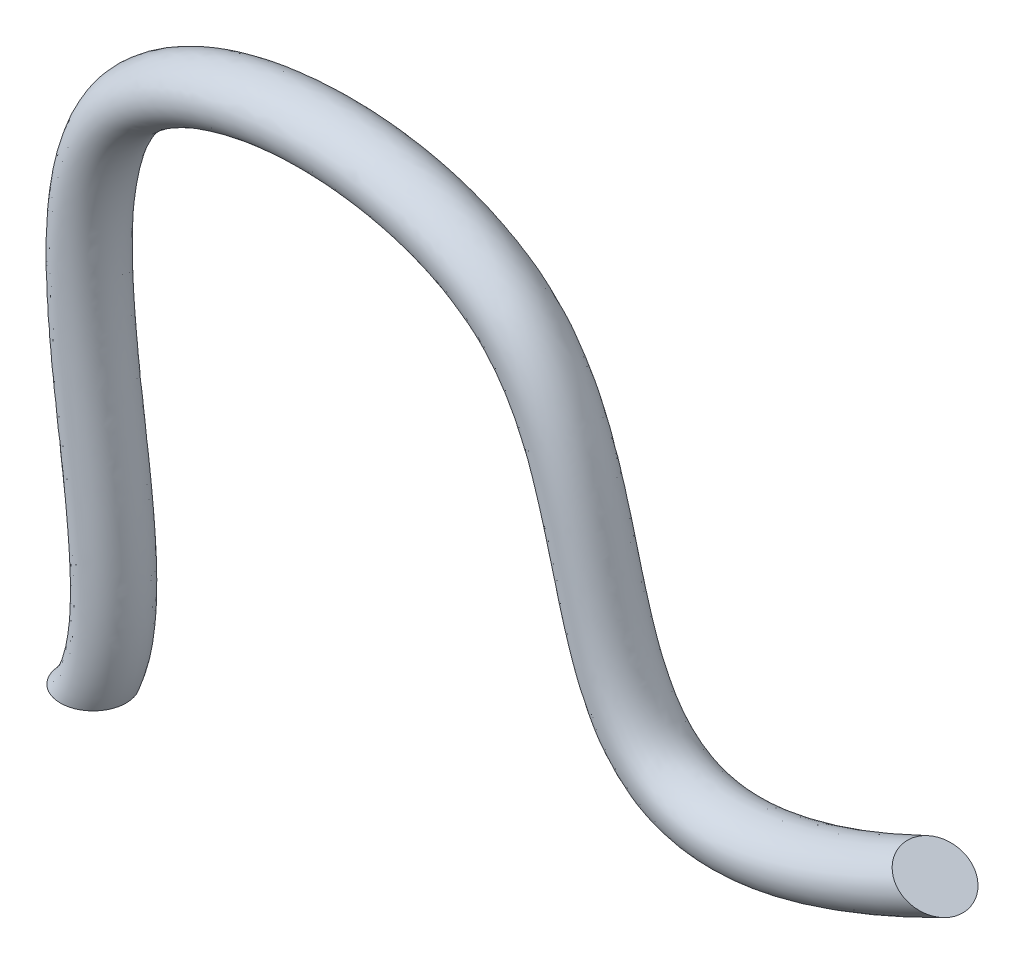
ISO-10303-21;
HEADER;
FILE_DESCRIPTION(('STEP AP214'),'2;1');
FILE_NAME('part.step','',(''),(''),'','','');
FILE_SCHEMA(('AUTOMOTIVE_DESIGN { 1 0 10303 214 1 1 1 1 }'));
ENDSEC;
DATA;
#1=APPLICATION_CONTEXT('core data for automotive mechanical design processes');
#2=APPLICATION_PROTOCOL_DEFINITION('international standard','automotive_design',2000,#1);
#3=PRODUCT_CONTEXT('',#1,'mechanical');
#4=PRODUCT('Part','Part','',(#3));
#5=PRODUCT_RELATED_PRODUCT_CATEGORY('part','',(#4));
#6=PRODUCT_DEFINITION_FORMATION('','',#4);
#7=PRODUCT_DEFINITION_CONTEXT('part definition',#1,'design');
#8=PRODUCT_DEFINITION('design','',#6,#7);
#9=PRODUCT_DEFINITION_SHAPE('','',#8);
#10=(LENGTH_UNIT() NAMED_UNIT(*) SI_UNIT(.MILLI.,.METRE.));
#11=(NAMED_UNIT(*) PLANE_ANGLE_UNIT() SI_UNIT($,.RADIAN.));
#12=(NAMED_UNIT(*) SI_UNIT($,.STERADIAN.) SOLID_ANGLE_UNIT());
#13=UNCERTAINTY_MEASURE_WITH_UNIT(LENGTH_MEASURE(1.E-05),#10,'distance_accuracy_value','');
#14=(GEOMETRIC_REPRESENTATION_CONTEXT(3) GLOBAL_UNCERTAINTY_ASSIGNED_CONTEXT((#13)) GLOBAL_UNIT_ASSIGNED_CONTEXT((#10,
#11,#12)) REPRESENTATION_CONTEXT('',''));
#15=CARTESIAN_POINT('',(0.,0.,0.));
#16=DIRECTION('',(0.,0.,1.));
#17=DIRECTION('',(1.,0.,0.));
#18=AXIS2_PLACEMENT_3D('',#15,#16,#17);
#19=CARTESIAN_POINT('',(0.,0.,0.));
#20=DIRECTION('',(0.,1.,0.));
#21=DIRECTION('',(0.,0.,1.));
#22=AXIS2_PLACEMENT_3D('',#19,#20,#21);
#23=PLANE('',#22);
#24=CARTESIAN_POINT('',(0.,0.,0.));
#25=DIRECTION('',(0.,1.,0.));
#26=DIRECTION('',(0.,0.,1.));
#27=AXIS2_PLACEMENT_3D('',#24,#25,#26);
#28=CIRCLE('',#27,3.81);
#29=CARTESIAN_POINT('',(0.,0.,3.81));
#30=VERTEX_POINT('',#29);
#31=EDGE_CURVE('E43',#30,#30,#28,.T.);
#32=ORIENTED_EDGE('',*,*,#31,.F.);
#33=EDGE_LOOP('',(#32));
#34=FACE_BOUND('',#33,.T.);
#35=ADVANCED_FACE('F37',(#34),#23,.F.);
#36=CARTESIAN_POINT('',(97.689172301197,29.5061660798113,0.));
#37=DIRECTION('',(0.5383872814832,0.842697534787618,0.));
#38=DIRECTION('',(0.,0.,1.));
#39=AXIS2_PLACEMENT_3D('',#36,#37,#38);
#40=PLANE('',#39);
#41=CARTESIAN_POINT('',(97.689172301197,29.5061660798113,0.));
#42=DIRECTION('',(0.5383872814832,0.842697534787618,0.));
#43=DIRECTION('',(0.,0.,1.));
#44=AXIS2_PLACEMENT_3D('',#41,#42,#43);
#45=CIRCLE('',#44,3.81);
#46=CARTESIAN_POINT('',(97.689172301197,29.5061660798113,3.81));
#47=VERTEX_POINT('',#46);
#48=EDGE_CURVE('E10',#47,#47,#45,.T.);
#49=ORIENTED_EDGE('',*,*,#48,.T.);
#50=EDGE_LOOP('',(#49));
#51=FACE_BOUND('',#50,.T.);
#52=ADVANCED_FACE('F52',(#51),#40,.T.);
#53=CARTESIAN_POINT('',(0.,0.,3.81));
#54=CARTESIAN_POINT('',(0.499544112924463,0.822005325097772,3.81));
#55=CARTESIAN_POINT('',(0.905078244488626,1.72269345057556,3.81));
#56=CARTESIAN_POINT('',(1.55395086488842,3.66234698235743,3.81));
#57=CARTESIAN_POINT('',(1.79728935254207,4.70131238953548,3.81));
#58=CARTESIAN_POINT('',(2.32274784063492,7.99699204557944,3.81));
#59=CARTESIAN_POINT('',(2.40031085917219,10.432489734156,3.81));
#60=CARTESIAN_POINT('',(2.21654621150553,15.6275343612159,3.81));
#61=CARTESIAN_POINT('',(1.95521854179704,18.387081302277,3.81));
#62=CARTESIAN_POINT('',(1.30026710443377,24.0775178550066,3.81));
#63=CARTESIAN_POINT('',(0.906643333910792,27.0084074687676,3.81));
#64=CARTESIAN_POINT('',(0.193694282196926,32.8888227872027,3.81));
#65=CARTESIAN_POINT('',(-0.125631001657487,35.8383484938451,3.81));
#66=CARTESIAN_POINT('',(-0.483388492398308,41.6033294180553,3.81));
#67=CARTESIAN_POINT('',(-0.521820702085268,44.4187846377239,3.81));
#68=CARTESIAN_POINT('',(-0.111197456538713,49.7629180078189,3.81));
#69=CARTESIAN_POINT('',(0.337857995462337,52.2915961606373,3.81));
#70=CARTESIAN_POINT('',(1.93005115257658,56.9094688167282,3.81));
#71=CARTESIAN_POINT('',(3.07318885473179,58.9986633225116,3.81));
#72=CARTESIAN_POINT('',(5.82868402124777,62.0993540958641,3.81));
#73=CARTESIAN_POINT('',(7.23018589179445,63.2494867957873,3.81));
#74=CARTESIAN_POINT('',(10.3979558979706,65.2319716083923,3.81));
#75=CARTESIAN_POINT('',(12.1642240366591,66.0643237212365,3.81));
#76=CARTESIAN_POINT('',(17.8388787781101,68.0804143462445,3.81));
#77=CARTESIAN_POINT('',(22.1231157158546,68.7831871448887,3.81));
#78=CARTESIAN_POINT('',(30.7802620869203,68.8832517289654,3.81));
#79=CARTESIAN_POINT('',(35.1531715257224,68.2805435144935,3.81));
#80=CARTESIAN_POINT('',(41.093843770632,66.38019110009,3.81));
#81=CARTESIAN_POINT('',(42.9709525356306,65.5806919465548,3.81));
#82=CARTESIAN_POINT('',(46.4047400452893,63.6467337197167,3.81));
#83=CARTESIAN_POINT('',(47.9614187926497,62.5122746462521,3.81));
#84=CARTESIAN_POINT('',(51.292070842978,59.2711288841867,3.81));
#85=CARTESIAN_POINT('',(52.8030064250359,56.9599916211141,3.81));
#86=CARTESIAN_POINT('',(55.2267709640214,51.9288420171132,3.81));
#87=CARTESIAN_POINT('',(56.139599916733,49.2088296718489,3.81));
#88=CARTESIAN_POINT('',(57.7297494095193,43.6977791089932,3.81));
#89=CARTESIAN_POINT('',(58.4070699445642,40.906740886752,3.81));
#90=CARTESIAN_POINT('',(59.8888008129707,35.5914877749684,3.81));
#91=CARTESIAN_POINT('',(60.6932111409211,33.0672728803798,3.81));
#92=CARTESIAN_POINT('',(62.2670926405137,29.7344549423049,3.81));
#93=CARTESIAN_POINT('',(62.8529308058004,28.6990996946164,3.81));
#94=CARTESIAN_POINT('',(64.1923539173928,26.8217884863889,3.81));
#95=CARTESIAN_POINT('',(64.9459388599319,25.9798325223859,3.81));
#96=CARTESIAN_POINT('',(66.6661803026741,24.5315510324037,3.81));
#97=CARTESIAN_POINT('',(67.6328367989934,23.9252255028321,3.81));
#98=CARTESIAN_POINT('',(69.8245461253426,22.9904360321554,3.81));
#99=CARTESIAN_POINT('',(71.0495989519789,22.6619720877986,3.81));
#100=CARTESIAN_POINT('',(73.8034257145377,22.3251369374415,3.81));
#101=CARTESIAN_POINT('',(75.3321996478941,22.3167657289968,3.81));
#102=CARTESIAN_POINT('',(78.7387933993859,22.6623472001919,3.81));
#103=CARTESIAN_POINT('',(80.6166132157202,23.0162998782031,3.81));
#104=CARTESIAN_POINT('',(86.8416286556984,24.6849904693055,3.81));
#105=CARTESIAN_POINT('',(91.7803802668383,26.606560936718,3.81));
#106=CARTESIAN_POINT('',(97.689172301197,29.5061660798113,3.81));
#107=CARTESIAN_POINT('',(7.62,0.,3.81));
#108=CARTESIAN_POINT('',(8.11954410888391,1.46209831678373,3.81));
#109=CARTESIAN_POINT('',(8.44468608640024,2.93091192344135,3.81));
#110=CARTESIAN_POINT('',(8.87614986005999,5.82819097738221,3.81));
#111=CARTESIAN_POINT('',(8.98351374140144,7.25969394565483,3.81));
#112=CARTESIAN_POINT('',(9.11136774605483,11.5282791290489,3.81));
#113=CARTESIAN_POINT('',(8.94380374632661,14.3503154299714,3.81));
#114=CARTESIAN_POINT('',(8.408783224927,20.0798212034479,3.81));
#115=CARTESIAN_POINT('',(8.03271573080499,22.9847182535783,3.81));
#116=CARTESIAN_POINT('',(7.25603641816095,28.8317843075131,3.81));
#117=CARTESIAN_POINT('',(6.85452332777499,31.7719536161747,3.81));
#118=CARTESIAN_POINT('',(6.22218983111786,37.5499267053511,3.81));
#119=CARTESIAN_POINT('',(5.99190375726283,40.3877898108017,3.81));
#120=CARTESIAN_POINT('',(5.9075152723849,45.7600104123651,3.81));
#121=CARTESIAN_POINT('',(6.05624512329866,48.2950314224914,3.81));
#122=CARTESIAN_POINT('',(6.9024682367422,52.780322963931,3.81));
#123=CARTESIAN_POINT('',(7.60736152843821,54.7226333787368,3.81));
#124=CARTESIAN_POINT('',(9.5527597994372,57.7156551606846,3.81));
#125=CARTESIAN_POINT('',(10.7721554150462,58.7421349221768,3.81));
#126=CARTESIAN_POINT('',(13.1771512790867,59.9215763609999,3.81));
#127=CARTESIAN_POINT('',(14.3217638931273,60.3911887557841,3.81));
#128=CARTESIAN_POINT('',(16.9246062569289,61.2491106583587,3.81));
#129=CARTESIAN_POINT('',(18.3816332389282,61.6318519550647,3.81));
#130=CARTESIAN_POINT('',(23.131070922182,62.5116231917697,3.81));
#131=CARTESIAN_POINT('',(26.8058736224671,62.7231721072226,3.81));
#132=CARTESIAN_POINT('',(34.1621615663983,62.0119520134837,3.81));
#133=CARTESIAN_POINT('',(37.8389420531112,61.0896298272271,3.81));
#134=CARTESIAN_POINT('',(42.4286966234305,58.8637345810533,3.81));
#135=CARTESIAN_POINT('',(43.8020202455058,57.9840575215896,3.81));
#136=CARTESIAN_POINT('',(46.0786384715308,56.0117362819636,3.81));
#137=CARTESIAN_POINT('',(46.9783074839113,54.9197137605528,3.81));
#138=CARTESIAN_POINT('',(48.5130090274343,52.0909533297121,3.81));
#139=CARTESIAN_POINT('',(49.2005139993151,50.2138070730781,3.81));
#140=CARTESIAN_POINT('',(50.5312293740737,45.892216565982,3.81));
#141=CARTESIAN_POINT('',(51.1404015970668,43.4538430110515,3.81));
#142=CARTESIAN_POINT('',(52.4099348017005,38.2377948736002,3.81));
#143=CARTESIAN_POINT('',(53.0666938483004,35.4682938551115,3.81));
#144=CARTESIAN_POINT('',(54.8091894924707,29.9087180460883,3.81));
#145=CARTESIAN_POINT('',(55.8900589179423,27.1074723196976,3.81));
#146=CARTESIAN_POINT('',(58.3710242545431,23.1757717961821,3.81));
#147=CARTESIAN_POINT('',(59.3465665244375,21.9115839861802,3.81));
#148=CARTESIAN_POINT('',(61.6937513016498,19.6022355305877,3.81));
#149=CARTESIAN_POINT('',(63.0705646072762,18.5594711055035,3.81));
#150=CARTESIAN_POINT('',(66.2083180223362,16.8915802059023,3.81));
#151=CARTESIAN_POINT('',(67.9649196376562,16.2745196687116,3.81));
#152=CARTESIAN_POINT('',(71.6631858531954,15.5565283962787,3.81));
#153=CARTESIAN_POINT('',(73.5953481307595,15.4505129646695,3.81));
#154=CARTESIAN_POINT('',(77.5325789282418,15.6483564325692,3.81));
#155=CARTESIAN_POINT('',(79.5415766368954,15.9466488985735,3.81));
#156=CARTESIAN_POINT('',(83.7181010736276,16.8741058289712,3.81));
#157=CARTESIAN_POINT('',(85.8892271515796,17.5044565711906,3.81));
#158=CARTESIAN_POINT('',(92.821684478563,19.9132790568948,3.81));
#159=CARTESIAN_POINT('',(98.0144667534702,22.2109320511066,3.81));
#160=CARTESIAN_POINT('',(104.110527516279,25.4036549949093,3.81));
#161=CARTESIAN_POINT('',(7.62,0.,-3.81));
#162=CARTESIAN_POINT('',(8.11954410888391,1.46209831678373,-3.81));
#163=CARTESIAN_POINT('',(8.44468608640024,2.93091192344135,-3.81));
#164=CARTESIAN_POINT('',(8.87614986005999,5.82819097738221,-3.81));
#165=CARTESIAN_POINT('',(8.9835137414012,7.25969394565483,-3.81));
#166=CARTESIAN_POINT('',(9.11136774605531,11.5282791290489,-3.81));
#167=CARTESIAN_POINT('',(8.94380374632661,14.3503154299725,-3.81));
#168=CARTESIAN_POINT('',(8.408783224927,20.0798212034468,-3.81));
#169=CARTESIAN_POINT('',(8.03271573080499,22.9847182535758,-3.81));
#170=CARTESIAN_POINT('',(7.25603641816095,28.8317843075156,-3.81));
#171=CARTESIAN_POINT('',(6.85452332777564,31.7719536161747,-3.81));
#172=CARTESIAN_POINT('',(6.22218983111722,37.5499267053511,-3.81));
#173=CARTESIAN_POINT('',(5.99190375726346,40.3877898108067,-3.81));
#174=CARTESIAN_POINT('',(5.90751527238427,45.7600104123601,-3.81));
#175=CARTESIAN_POINT('',(6.05624512329866,48.2950314224914,-3.81));
#176=CARTESIAN_POINT('',(6.9024682367422,52.780322963931,-3.81));
#177=CARTESIAN_POINT('',(7.60736152843821,54.7226333787368,-3.81));
#178=CARTESIAN_POINT('',(9.5527597994372,57.7156551606846,-3.81));
#179=CARTESIAN_POINT('',(10.7721554150462,58.7421349221768,-3.81));
#180=CARTESIAN_POINT('',(13.1771512790867,59.9215763609999,-3.81));
#181=CARTESIAN_POINT('',(14.3217638931273,60.3911887557841,-3.81));
#182=CARTESIAN_POINT('',(16.9246062569289,61.2491106583587,-3.81));
#183=CARTESIAN_POINT('',(18.381633238929,61.6318519550647,-3.81));
#184=CARTESIAN_POINT('',(23.1310709221803,62.5116231917697,-3.81));
#185=CARTESIAN_POINT('',(26.8058736224671,62.7231721072226,-3.81));
#186=CARTESIAN_POINT('',(34.1621615663983,62.0119520134837,-3.81));
#187=CARTESIAN_POINT('',(37.8389420531112,61.0896298272271,-3.81));
#188=CARTESIAN_POINT('',(42.4286966234305,58.8637345810533,-3.81));
#189=CARTESIAN_POINT('',(43.8020202455058,57.9840575215828,-3.81));
#190=CARTESIAN_POINT('',(46.0786384715308,56.0117362819704,-3.81));
#191=CARTESIAN_POINT('',(46.9783074839113,54.9197137605528,-3.81));
#192=CARTESIAN_POINT('',(48.5130090274343,52.0909533297121,-3.81));
#193=CARTESIAN_POINT('',(49.20051399932,50.2138070730781,-3.81));
#194=CARTESIAN_POINT('',(50.5312293740689,45.892216565982,-3.81));
#195=CARTESIAN_POINT('',(51.1404015970668,43.4538430110515,-3.81));
#196=CARTESIAN_POINT('',(52.4099348017005,38.2377948736002,-3.81));
#197=CARTESIAN_POINT('',(53.0666938483004,35.4682938551115,-3.81));
#198=CARTESIAN_POINT('',(54.8091894924707,29.9087180460883,-3.81));
#199=CARTESIAN_POINT('',(55.8900589179423,27.1074723197018,-3.81));
#200=CARTESIAN_POINT('',(58.3710242545431,23.1757717961799,-3.81));
#201=CARTESIAN_POINT('',(59.3465665244375,21.9115839861822,-3.81));
#202=CARTESIAN_POINT('',(61.6937513016498,19.6022355305857,-3.81));
#203=CARTESIAN_POINT('',(63.0705646072762,18.5594711055016,-3.81));
#204=CARTESIAN_POINT('',(66.2083180223362,16.8915802059042,-3.81));
#205=CARTESIAN_POINT('',(67.9649196376562,16.2745196687116,-3.81));
#206=CARTESIAN_POINT('',(71.6631858531954,15.5565283962787,-3.81));
#207=CARTESIAN_POINT('',(73.5953481307595,15.4505129646695,-3.81));
#208=CARTESIAN_POINT('',(77.5325789282418,15.6483564325692,-3.81));
#209=CARTESIAN_POINT('',(79.5415766368895,15.9466488985735,-3.81));
#210=CARTESIAN_POINT('',(83.7181010736335,16.8741058289712,-3.81));
#211=CARTESIAN_POINT('',(85.8892271515796,17.5044565711924,-3.81));
#212=CARTESIAN_POINT('',(92.821684478563,19.9132790568911,-3.81));
#213=CARTESIAN_POINT('',(98.0144667534702,22.2109320510609,-3.81));
#214=CARTESIAN_POINT('',(104.110527516279,25.4036549949093,-3.81));
#215=CARTESIAN_POINT('',(0.,0.,-3.81));
#216=CARTESIAN_POINT('',(0.499544112924464,0.822005325097772,-3.81));
#217=CARTESIAN_POINT('',(0.905078244488627,1.72269345057556,-3.81));
#218=CARTESIAN_POINT('',(1.55395086488842,3.66234698235743,-3.81));
#219=CARTESIAN_POINT('',(1.79728935254207,4.70131238953548,-3.81));
#220=CARTESIAN_POINT('',(2.32274784063492,7.99699204557944,-3.81));
#221=CARTESIAN_POINT('',(2.40031085917219,10.432489734156,-3.81));
#222=CARTESIAN_POINT('',(2.21654621150553,15.6275343612159,-3.81));
#223=CARTESIAN_POINT('',(1.95521854179704,18.387081302277,-3.81));
#224=CARTESIAN_POINT('',(1.30026710443377,24.0775178550066,-3.81));
#225=CARTESIAN_POINT('',(0.906643333910792,27.0084074687676,-3.81));
#226=CARTESIAN_POINT('',(0.193694282196926,32.8888227872027,-3.81));
#227=CARTESIAN_POINT('',(-0.125631001657487,35.8383484938451,-3.81));
#228=CARTESIAN_POINT('',(-0.483388492398308,41.6033294180553,-3.81));
#229=CARTESIAN_POINT('',(-0.521820702085268,44.4187846377239,-3.81));
#230=CARTESIAN_POINT('',(-0.111197456538713,49.7629180078189,-3.81));
#231=CARTESIAN_POINT('',(0.337857995462337,52.2915961606373,-3.81));
#232=CARTESIAN_POINT('',(1.93005115257658,56.9094688167282,-3.81));
#233=CARTESIAN_POINT('',(3.07318885473179,58.9986633225116,-3.81));
#234=CARTESIAN_POINT('',(5.82868402124777,62.0993540958641,-3.81));
#235=CARTESIAN_POINT('',(7.23018589179445,63.2494867957873,-3.81));
#236=CARTESIAN_POINT('',(10.3979558979706,65.2319716083923,-3.81));
#237=CARTESIAN_POINT('',(12.1642240366591,66.0643237212365,-3.81));
#238=CARTESIAN_POINT('',(17.8388787781101,68.0804143462445,-3.81));
#239=CARTESIAN_POINT('',(22.1231157158546,68.7831871448887,-3.81));
#240=CARTESIAN_POINT('',(30.7802620869203,68.8832517289654,-3.81));
#241=CARTESIAN_POINT('',(35.1531715257224,68.2805435144935,-3.81));
#242=CARTESIAN_POINT('',(41.093843770632,66.38019110009,-3.81));
#243=CARTESIAN_POINT('',(42.9709525356306,65.5806919465548,-3.81));
#244=CARTESIAN_POINT('',(46.4047400452893,63.6467337197167,-3.81));
#245=CARTESIAN_POINT('',(47.9614187926497,62.5122746462521,-3.81));
#246=CARTESIAN_POINT('',(51.292070842978,59.2711288841867,-3.81));
#247=CARTESIAN_POINT('',(52.8030064250359,56.9599916211141,-3.81));
#248=CARTESIAN_POINT('',(55.2267709640214,51.9288420171132,-3.81));
#249=CARTESIAN_POINT('',(56.139599916733,49.2088296718489,-3.81));
#250=CARTESIAN_POINT('',(57.7297494095193,43.6977791089932,-3.81));
#251=CARTESIAN_POINT('',(58.4070699445642,40.906740886752,-3.81));
#252=CARTESIAN_POINT('',(59.8888008129707,35.5914877749684,-3.81));
#253=CARTESIAN_POINT('',(60.6932111409211,33.0672728803798,-3.81));
#254=CARTESIAN_POINT('',(62.2670926405137,29.7344549423049,-3.81));
#255=CARTESIAN_POINT('',(62.8529308058004,28.6990996946164,-3.81));
#256=CARTESIAN_POINT('',(64.1923539173928,26.8217884863889,-3.81));
#257=CARTESIAN_POINT('',(64.9459388599319,25.9798325223859,-3.81));
#258=CARTESIAN_POINT('',(66.6661803026741,24.5315510324037,-3.81));
#259=CARTESIAN_POINT('',(67.6328367989934,23.9252255028321,-3.81));
#260=CARTESIAN_POINT('',(69.8245461253426,22.9904360321554,-3.81));
#261=CARTESIAN_POINT('',(71.0495989519789,22.6619720877986,-3.81));
#262=CARTESIAN_POINT('',(73.8034257145377,22.3251369374415,-3.81));
#263=CARTESIAN_POINT('',(75.3321996478941,22.3167657289968,-3.81));
#264=CARTESIAN_POINT('',(78.7387933993859,22.6623472001919,-3.81));
#265=CARTESIAN_POINT('',(80.6166132157202,23.0162998782031,-3.81));
#266=CARTESIAN_POINT('',(86.8416286556984,24.6849904693055,-3.81));
#267=CARTESIAN_POINT('',(91.7803802668383,26.606560936718,-3.81));
#268=CARTESIAN_POINT('',(97.689172301197,29.5061660798113,-3.81));
#269=CARTESIAN_POINT('',(-7.62,0.,-3.81));
#270=CARTESIAN_POINT('',(-7.12045588303498,0.181912333411809,-3.81));
#271=CARTESIAN_POINT('',(-6.63452959742298,0.514474977709772,-3.81));
#272=CARTESIAN_POINT('',(-5.76824813028314,1.49650298733264,-3.81));
#273=CARTESIAN_POINT('',(-5.38893503631706,2.14293083341613,-3.81));
#274=CARTESIAN_POINT('',(-4.46587206478548,4.46570496210998,-3.81));
#275=CARTESIAN_POINT('',(-4.14318202798223,6.51466403833952,-3.81));
#276=CARTESIAN_POINT('',(-3.97569080191594,11.1752475189851,-3.81));
#277=CARTESIAN_POINT('',(-4.12227864721092,13.7894443509781,-3.81));
#278=CARTESIAN_POINT('',(-4.65550220929341,19.3232514024976,-3.81));
#279=CARTESIAN_POINT('',(-5.04123665995405,22.2448613213604,-3.81));
#280=CARTESIAN_POINT('',(-5.83480126672337,28.2277188690542,-3.81));
#281=CARTESIAN_POINT('',(-6.24316576057843,31.2889071768836,-3.81));
#282=CARTESIAN_POINT('',(-6.87429225718089,37.4466484237505,-3.81));
#283=CARTESIAN_POINT('',(-7.09988652746919,40.5425378529564,-3.81));
#284=CARTESIAN_POINT('',(-7.12486314981962,46.7455130517067,-3.81));
#285=CARTESIAN_POINT('',(-6.93164553751353,49.8605589425379,-3.81));
#286=CARTESIAN_POINT('',(-5.69265749428405,56.1032824727718,-3.81));
#287=CARTESIAN_POINT('',(-4.62577770558258,59.2551917228463,-3.81));
#288=CARTESIAN_POINT('',(-1.5197832365912,64.2771318307284,-3.81));
#289=CARTESIAN_POINT('',(0.138607890461597,66.1077848357905,-3.81));
#290=CARTESIAN_POINT('',(3.87130553901234,69.214832558426,-3.81));
#291=CARTESIAN_POINT('',(5.94681483438912,70.4967954874084,-3.81));
#292=CARTESIAN_POINT('',(12.54668663404,73.6492055007193,-3.81));
#293=CARTESIAN_POINT('',(17.4403578092421,74.8432021825549,-3.81));
#294=CARTESIAN_POINT('',(27.3983626074424,75.754551444447,-3.81));
#295=CARTESIAN_POINT('',(32.4674009983337,75.4714572017599,-3.81));
#296=CARTESIAN_POINT('',(39.7589909178335,73.8966476191266,-3.81));
#297=CARTESIAN_POINT('',(42.1398848257555,73.1773263715268,-3.81));
#298=CARTESIAN_POINT('',(46.7308416190478,71.281731157463,-3.81));
#299=CARTESIAN_POINT('',(48.9445301013881,70.1048355319513,-3.81));
#300=CARTESIAN_POINT('',(54.0711326585217,66.4513044386612,-3.81));
#301=CARTESIAN_POINT('',(56.4054988507519,63.7061761691501,-3.81));
#302=CARTESIAN_POINT('',(59.922312553974,57.9654674682444,-3.81));
#303=CARTESIAN_POINT('',(61.1387982363993,54.9638163326463,-3.81));
#304=CARTESIAN_POINT('',(63.0495640173382,49.1577633443861,-3.81));
#305=CARTESIAN_POINT('',(63.747446040828,46.3451879183925,-3.81));
#306=CARTESIAN_POINT('',(64.9684121334707,41.2742575038485,-3.81));
#307=CARTESIAN_POINT('',(65.4963633638998,39.0270734410577,-3.81));
#308=CARTESIAN_POINT('',(66.1631610264843,36.2931380884298,-3.81));
#309=CARTESIAN_POINT('',(66.3592950871633,35.4866154030507,-3.81));
#310=CARTESIAN_POINT('',(66.6909565331359,34.041341442192,-3.81));
#311=CARTESIAN_POINT('',(66.8213131125877,33.4001939392701,-3.81));
#312=CARTESIAN_POINT('',(67.1240425830119,32.1715218589031,-3.81));
#313=CARTESIAN_POINT('',(67.3007539603307,31.5759313369526,-3.81));
#314=CARTESIAN_POINT('',(67.9859063974899,30.4243436680321,-3.81));
#315=CARTESIAN_POINT('',(68.5038497731982,29.8734312109277,-3.81));
#316=CARTESIAN_POINT('',(70.0742725008336,29.0019174423138,-3.81));
#317=CARTESIAN_POINT('',(71.1228226588986,28.68688255942,-3.81));
#318=CARTESIAN_POINT('',(73.7594857251383,28.4505885714126,-3.81));
#319=CARTESIAN_POINT('',(75.3439992798608,28.5281431852138,-3.81));
#320=CARTESIAN_POINT('',(80.8615728328338,29.45670188172,-3.81));
#321=CARTESIAN_POINT('',(85.5462937802063,31.0021898223751,-3.81));
#322=CARTESIAN_POINT('',(91.2678170861154,33.6086771647133,-3.81));
#323=CARTESIAN_POINT('',(-7.62,0.,3.81));
#324=CARTESIAN_POINT('',(-7.12045588303498,0.181912333411809,3.81));
#325=CARTESIAN_POINT('',(-6.63452959742298,0.514474977709772,3.81));
#326=CARTESIAN_POINT('',(-5.76824813028314,1.49650298733264,3.81));
#327=CARTESIAN_POINT('',(-5.3889350363173,2.14293083341613,3.81));
#328=CARTESIAN_POINT('',(-4.465872064785,4.46570496210998,3.81));
#329=CARTESIAN_POINT('',(-4.14318202798223,6.51466403834064,3.81));
#330=CARTESIAN_POINT('',(-3.97569080191594,11.175247518984,3.81));
#331=CARTESIAN_POINT('',(-4.12227864721092,13.7894443509757,3.81));
#332=CARTESIAN_POINT('',(-4.65550220929341,19.3232514025001,3.81));
#333=CARTESIAN_POINT('',(-5.04123665995341,22.2448613213604,3.81));
#334=CARTESIAN_POINT('',(-5.83480126672401,28.2277188690542,3.81));
#335=CARTESIAN_POINT('',(-6.24316576057781,31.2889071768886,3.81));
#336=CARTESIAN_POINT('',(-6.87429225718151,37.4466484237455,3.81));
#337=CARTESIAN_POINT('',(-7.0998865274692,40.5425378529564,3.81));
#338=CARTESIAN_POINT('',(-7.12486314981963,46.7455130517067,3.81));
#339=CARTESIAN_POINT('',(-6.93164553751353,49.8605589425379,3.81));
#340=CARTESIAN_POINT('',(-5.69265749428405,56.1032824727718,3.81));
#341=CARTESIAN_POINT('',(-4.62577770558258,59.2551917228463,3.81));
#342=CARTESIAN_POINT('',(-1.5197832365912,64.2771318307284,3.81));
#343=CARTESIAN_POINT('',(0.138607890461596,66.1077848357905,3.81));
#344=CARTESIAN_POINT('',(3.87130553901234,69.214832558426,3.81));
#345=CARTESIAN_POINT('',(5.94681483438999,70.4967954874084,3.81));
#346=CARTESIAN_POINT('',(12.5466866340382,73.6492055007193,3.81));
#347=CARTESIAN_POINT('',(17.4403578092421,74.8432021825549,3.81));
#348=CARTESIAN_POINT('',(27.3983626074424,75.754551444447,3.81));
#349=CARTESIAN_POINT('',(32.4674009983337,75.4714572017599,3.81));
#350=CARTESIAN_POINT('',(39.7589909178335,73.8966476191266,3.81));
#351=CARTESIAN_POINT('',(42.1398848257555,73.17732637152,3.81));
#352=CARTESIAN_POINT('',(46.7308416190478,71.2817311574698,3.81));
#353=CARTESIAN_POINT('',(48.9445301013881,70.1048355319513,3.81));
#354=CARTESIAN_POINT('',(54.0711326585217,66.4513044386612,3.81));
#355=CARTESIAN_POINT('',(56.4054988507568,63.7061761691501,3.81));
#356=CARTESIAN_POINT('',(59.9223125539691,57.9654674682444,3.81));
#357=CARTESIAN_POINT('',(61.1387982363993,54.9638163326463,3.81));
#358=CARTESIAN_POINT('',(63.0495640173382,49.1577633443861,3.81));
#359=CARTESIAN_POINT('',(63.747446040828,46.3451879183925,3.81));
#360=CARTESIAN_POINT('',(64.9684121334707,41.2742575038485,3.81));
#361=CARTESIAN_POINT('',(65.4963633638998,39.0270734410619,3.81));
#362=CARTESIAN_POINT('',(66.1631610264843,36.2931380884277,3.81));
#363=CARTESIAN_POINT('',(66.3592950871633,35.4866154030527,3.81));
#364=CARTESIAN_POINT('',(66.6909565331359,34.04134144219,3.81));
#365=CARTESIAN_POINT('',(66.8213131125877,33.4001939392682,3.81));
#366=CARTESIAN_POINT('',(67.1240425830119,32.1715218589051,3.81));
#367=CARTESIAN_POINT('',(67.3007539603307,31.5759313369526,3.81));
#368=CARTESIAN_POINT('',(67.9859063974899,30.4243436680321,3.81));
#369=CARTESIAN_POINT('',(68.5038497731982,29.8734312109277,3.81));
#370=CARTESIAN_POINT('',(70.0742725008336,29.0019174423138,3.81));
#371=CARTESIAN_POINT('',(71.1228226588927,28.68688255942,3.81));
#372=CARTESIAN_POINT('',(73.7594857251443,28.4505885714126,3.81));
#373=CARTESIAN_POINT('',(75.3439992798608,28.5281431852157,3.81));
#374=CARTESIAN_POINT('',(80.8615728328338,29.4567018817163,3.81));
#375=CARTESIAN_POINT('',(85.5462937802063,31.0021898223295,3.81));
#376=CARTESIAN_POINT('',(91.2678170861154,33.6086771647133,3.81));
#377=CARTESIAN_POINT('',(0.,0.,3.81));
#378=CARTESIAN_POINT('',(0.499544112924463,0.822005325097772,3.81));
#379=CARTESIAN_POINT('',(0.905078244488626,1.72269345057556,3.81));
#380=CARTESIAN_POINT('',(1.55395086488842,3.66234698235743,3.81));
#381=CARTESIAN_POINT('',(1.79728935254207,4.70131238953548,3.81));
#382=CARTESIAN_POINT('',(2.32274784063492,7.99699204557944,3.81));
#383=CARTESIAN_POINT('',(2.40031085917219,10.432489734156,3.81));
#384=CARTESIAN_POINT('',(2.21654621150553,15.6275343612159,3.81));
#385=CARTESIAN_POINT('',(1.95521854179704,18.387081302277,3.81));
#386=CARTESIAN_POINT('',(1.30026710443377,24.0775178550066,3.81));
#387=CARTESIAN_POINT('',(0.906643333910792,27.0084074687676,3.81));
#388=CARTESIAN_POINT('',(0.193694282196926,32.8888227872027,3.81));
#389=CARTESIAN_POINT('',(-0.125631001657487,35.8383484938451,3.81));
#390=CARTESIAN_POINT('',(-0.483388492398308,41.6033294180553,3.81));
#391=CARTESIAN_POINT('',(-0.521820702085268,44.4187846377239,3.81));
#392=CARTESIAN_POINT('',(-0.111197456538713,49.7629180078189,3.81));
#393=CARTESIAN_POINT('',(0.337857995462337,52.2915961606373,3.81));
#394=CARTESIAN_POINT('',(1.93005115257658,56.9094688167282,3.81));
#395=CARTESIAN_POINT('',(3.07318885473179,58.9986633225116,3.81));
#396=CARTESIAN_POINT('',(5.82868402124777,62.0993540958641,3.81));
#397=CARTESIAN_POINT('',(7.23018589179445,63.2494867957873,3.81));
#398=CARTESIAN_POINT('',(10.3979558979706,65.2319716083923,3.81));
#399=CARTESIAN_POINT('',(12.1642240366591,66.0643237212365,3.81));
#400=CARTESIAN_POINT('',(17.8388787781101,68.0804143462445,3.81));
#401=CARTESIAN_POINT('',(22.1231157158546,68.7831871448887,3.81));
#402=CARTESIAN_POINT('',(30.7802620869203,68.8832517289654,3.81));
#403=CARTESIAN_POINT('',(35.1531715257224,68.2805435144935,3.81));
#404=CARTESIAN_POINT('',(41.093843770632,66.38019110009,3.81));
#405=CARTESIAN_POINT('',(42.9709525356306,65.5806919465548,3.81));
#406=CARTESIAN_POINT('',(46.4047400452893,63.6467337197167,3.81));
#407=CARTESIAN_POINT('',(47.9614187926497,62.5122746462521,3.81));
#408=CARTESIAN_POINT('',(51.292070842978,59.2711288841867,3.81));
#409=CARTESIAN_POINT('',(52.8030064250359,56.9599916211141,3.81));
#410=CARTESIAN_POINT('',(55.2267709640214,51.9288420171132,3.81));
#411=CARTESIAN_POINT('',(56.139599916733,49.2088296718489,3.81));
#412=CARTESIAN_POINT('',(57.7297494095193,43.6977791089932,3.81));
#413=CARTESIAN_POINT('',(58.4070699445642,40.906740886752,3.81));
#414=CARTESIAN_POINT('',(59.8888008129707,35.5914877749684,3.81));
#415=CARTESIAN_POINT('',(60.6932111409211,33.0672728803798,3.81));
#416=CARTESIAN_POINT('',(62.2670926405137,29.7344549423049,3.81));
#417=CARTESIAN_POINT('',(62.8529308058004,28.6990996946164,3.81));
#418=CARTESIAN_POINT('',(64.1923539173928,26.8217884863889,3.81));
#419=CARTESIAN_POINT('',(64.9459388599319,25.9798325223859,3.81));
#420=CARTESIAN_POINT('',(66.6661803026741,24.5315510324037,3.81));
#421=CARTESIAN_POINT('',(67.6328367989934,23.9252255028321,3.81));
#422=CARTESIAN_POINT('',(69.8245461253426,22.9904360321554,3.81));
#423=CARTESIAN_POINT('',(71.0495989519789,22.6619720877986,3.81));
#424=CARTESIAN_POINT('',(73.8034257145377,22.3251369374415,3.81));
#425=CARTESIAN_POINT('',(75.3321996478941,22.3167657289968,3.81));
#426=CARTESIAN_POINT('',(78.7387933993859,22.6623472001919,3.81));
#427=CARTESIAN_POINT('',(80.6166132157202,23.0162998782031,3.81));
#428=CARTESIAN_POINT('',(86.8416286556984,24.6849904693055,3.81));
#429=CARTESIAN_POINT('',(91.7803802668383,26.606560936718,3.81));
#430=CARTESIAN_POINT('',(97.689172301197,29.5061660798113,3.81));
#431=(BOUNDED_SURFACE() B_SPLINE_SURFACE(3,3,((#53,#54,#55,#56,#57,#58,#59,#60,#61,#62,#63,#64,
#65,#66,#67,#68,#69,#70,#71,#72,#73,#74,#75,#76,#77,#78,#79,#80,#81,#82,#83,#84,#85,#86,#87,#88,
#89,#90,#91,#92,#93,#94,#95,#96,#97,#98,#99,#100,#101,#102,#103,#104,#105,#106),(#107,#108,#109,
#110,#111,#112,#113,#114,#115,#116,#117,#118,#119,#120,#121,#122,#123,#124,#125,#126,#127,#128,
#129,#130,#131,#132,#133,#134,#135,#136,#137,#138,#139,#140,#141,#142,#143,#144,#145,#146,#147,
#148,#149,#150,#151,#152,#153,#154,#155,#156,#157,#158,#159,#160),(#161,#162,#163,#164,#165,
#166,#167,#168,#169,#170,#171,#172,#173,#174,#175,#176,#177,#178,#179,#180,#181,#182,#183,#184,
#185,#186,#187,#188,#189,#190,#191,#192,#193,#194,#195,#196,#197,#198,#199,#200,#201,#202,#203,
#204,#205,#206,#207,#208,#209,#210,#211,#212,#213,#214),(#215,#216,#217,#218,#219,#220,#221,
#222,#223,#224,#225,#226,#227,#228,#229,#230,#231,#232,#233,#234,#235,#236,#237,#238,#239,#240,
#241,#242,#243,#244,#245,#246,#247,#248,#249,#250,#251,#252,#253,#254,#255,#256,#257,#258,#259,
#260,#261,#262,#263,#264,#265,#266,#267,#268),(#269,#270,#271,#272,#273,#274,#275,#276,#277,
#278,#279,#280,#281,#282,#283,#284,#285,#286,#287,#288,#289,#290,#291,#292,#293,#294,#295,#296,
#297,#298,#299,#300,#301,#302,#303,#304,#305,#306,#307,#308,#309,#310,#311,#312,#313,#314,#315,
#316,#317,#318,#319,#320,#321,#322),(#323,#324,#325,#326,#327,#328,#329,#330,#331,#332,#333,
#334,#335,#336,#337,#338,#339,#340,#341,#342,#343,#344,#345,#346,#347,#348,#349,#350,#351,#352,
#353,#354,#355,#356,#357,#358,#359,#360,#361,#362,#363,#364,#365,#366,#367,#368,#369,#370,#371,
#372,#373,#374,#375,#376),(#377,#378,#379,#380,#381,#382,#383,#384,#385,#386,#387,#388,#389,
#390,#391,#392,#393,#394,#395,#396,#397,#398,#399,#400,#401,#402,#403,#404,#405,#406,#407,#408,
#409,#410,#411,#412,#413,#414,#415,#416,#417,#418,#419,#420,#421,#422,#423,#424,#425,#426,#427,
#428,#429,#430)),.UNSPECIFIED.,.T.,.F.,.F.) B_SPLINE_SURFACE_WITH_KNOTS((4,3,4),(4,2,2,2,2,2,2,
2,2,2,2,2,2,2,2,2,2,2,2,2,2,2,2,2,2,2,4),(0.,0.5,1.),(0.,0.0222149583352059,0.0444299166704117,
0.0888598333408234,0.133289750011235,0.177719666681647,0.222149583352059,0.26657950002247,
0.311009416692882,0.355439333363294,0.387839197206418,0.420239061049542,0.48503878873579,
0.549838516422039,0.582238380265163,0.614638244108287,0.662808463594751,0.710978683081215,
0.759148902567679,0.807319122054144,0.831404231797376,0.855489341540608,0.87957445128384,
0.903659561027072,0.927744670770304,0.951829780513536,1.),
.UNSPECIFIED.) GEOMETRIC_REPRESENTATION_ITEM() RATIONAL_B_SPLINE_SURFACE(((1.,1.,1.,1.,1.,1.,1.,
1.,1.,1.,1.,1.,1.,1.,1.,1.,1.,1.,1.,1.,1.,1.,1.,1.,1.,1.,1.,1.,1.,1.,1.,1.,1.,1.,1.,1.,1.,1.,1.,
1.,1.,1.,1.,1.,1.,1.,1.,1.,1.,1.,1.,1.,1.,1.),(0.333333333333333,0.333333333333333,
0.333333333333333,0.333333333333333,0.333333333333333,0.333333333333333,0.333333333333333,
0.333333333333333,0.333333333333333,0.333333333333333,0.333333333333333,0.333333333333333,
0.333333333333333,0.333333333333333,0.333333333333333,0.333333333333333,0.333333333333333,
0.333333333333333,0.333333333333333,0.333333333333333,0.333333333333333,0.333333333333333,
0.333333333333333,0.333333333333333,0.333333333333333,0.333333333333333,0.333333333333333,
0.333333333333333,0.333333333333333,0.333333333333333,0.333333333333333,0.333333333333333,
0.333333333333333,0.333333333333333,0.333333333333333,0.333333333333333,0.333333333333333,
0.333333333333333,0.333333333333333,0.333333333333333,0.333333333333333,0.333333333333333,
0.333333333333333,0.333333333333333,0.333333333333333,0.333333333333333,0.333333333333333,
0.333333333333333,0.333333333333333,0.333333333333333,0.333333333333333,0.333333333333333,
0.333333333333333,0.333333333333333),(0.333333333333333,0.333333333333333,0.333333333333333,
0.333333333333333,0.333333333333333,0.333333333333333,0.333333333333333,0.333333333333333,
0.333333333333333,0.333333333333333,0.333333333333333,0.333333333333333,0.333333333333333,
0.333333333333333,0.333333333333333,0.333333333333333,0.333333333333333,0.333333333333333,
0.333333333333333,0.333333333333333,0.333333333333333,0.333333333333333,0.333333333333333,
0.333333333333333,0.333333333333333,0.333333333333333,0.333333333333333,0.333333333333333,
0.333333333333333,0.333333333333333,0.333333333333333,0.333333333333333,0.333333333333333,
0.333333333333333,0.333333333333333,0.333333333333333,0.333333333333333,0.333333333333333,
0.333333333333333,0.333333333333333,0.333333333333333,0.333333333333333,0.333333333333333,
0.333333333333333,0.333333333333333,0.333333333333333,0.333333333333333,0.333333333333333,
0.333333333333333,0.333333333333333,0.333333333333333,0.333333333333333,0.333333333333333,
0.333333333333333),(1.,1.,1.,1.,1.,1.,1.,1.,1.,1.,1.,1.,1.,1.,1.,1.,1.,1.,1.,1.,1.,1.,1.,1.,1.,
1.,1.,1.,1.,1.,1.,1.,1.,1.,1.,1.,1.,1.,1.,1.,1.,1.,1.,1.,1.,1.,1.,1.,1.,1.,1.,1.,1.,1.),
(0.333333333333333,0.333333333333333,0.333333333333333,0.333333333333333,0.333333333333333,
0.333333333333333,0.333333333333333,0.333333333333333,0.333333333333333,0.333333333333333,
0.333333333333333,0.333333333333333,0.333333333333333,0.333333333333333,0.333333333333333,
0.333333333333333,0.333333333333333,0.333333333333333,0.333333333333333,0.333333333333333,
0.333333333333333,0.333333333333333,0.333333333333333,0.333333333333333,0.333333333333333,
0.333333333333333,0.333333333333333,0.333333333333333,0.333333333333333,0.333333333333333,
0.333333333333333,0.333333333333333,0.333333333333333,0.333333333333333,0.333333333333333,
0.333333333333333,0.333333333333333,0.333333333333333,0.333333333333333,0.333333333333333,
0.333333333333333,0.333333333333333,0.333333333333333,0.333333333333333,0.333333333333333,
0.333333333333333,0.333333333333333,0.333333333333333,0.333333333333333,0.333333333333333,
0.333333333333333,0.333333333333333,0.333333333333333,0.333333333333333),(0.333333333333333,
0.333333333333333,0.333333333333333,0.333333333333333,0.333333333333333,0.333333333333333,
0.333333333333333,0.333333333333333,0.333333333333333,0.333333333333333,0.333333333333333,
0.333333333333333,0.333333333333333,0.333333333333333,0.333333333333333,0.333333333333333,
0.333333333333333,0.333333333333333,0.333333333333333,0.333333333333333,0.333333333333333,
0.333333333333333,0.333333333333333,0.333333333333333,0.333333333333333,0.333333333333333,
0.333333333333333,0.333333333333333,0.333333333333333,0.333333333333333,0.333333333333333,
0.333333333333333,0.333333333333333,0.333333333333333,0.333333333333333,0.333333333333333,
0.333333333333333,0.333333333333333,0.333333333333333,0.333333333333333,0.333333333333333,
0.333333333333333,0.333333333333333,0.333333333333333,0.333333333333333,0.333333333333333,
0.333333333333333,0.333333333333333,0.333333333333333,0.333333333333333,0.333333333333333,
0.333333333333333,0.333333333333333,0.333333333333333),(1.,1.,1.,1.,1.,1.,1.,1.,1.,1.,1.,1.,1.,
1.,1.,1.,1.,1.,1.,1.,1.,1.,1.,1.,1.,1.,1.,1.,1.,1.,1.,1.,1.,1.,1.,1.,1.,1.,1.,1.,1.,1.,1.,1.,1.,
1.,1.,1.,1.,1.,1.,1.,1.,1.))) REPRESENTATION_ITEM('') SURFACE());
#432=ORIENTED_EDGE('',*,*,#48,.F.);
#433=EDGE_LOOP('',(#432));
#434=FACE_BOUND('',#433,.T.);
#435=ORIENTED_EDGE('',*,*,#31,.T.);
#436=EDGE_LOOP('',(#435));
#437=FACE_BOUND('',#436,.T.);
#438=ADVANCED_FACE('F49',(#434,#437),#431,.T.);
#439=CLOSED_SHELL('',(#35,#52,#438));
#440=MANIFOLD_SOLID_BREP('B2',#439);
#441=ADVANCED_BREP_SHAPE_REPRESENTATION('',(#18,#440),#14);
#442=SHAPE_DEFINITION_REPRESENTATION(#9,#441);
ENDSEC;
END-ISO-10303-21;
